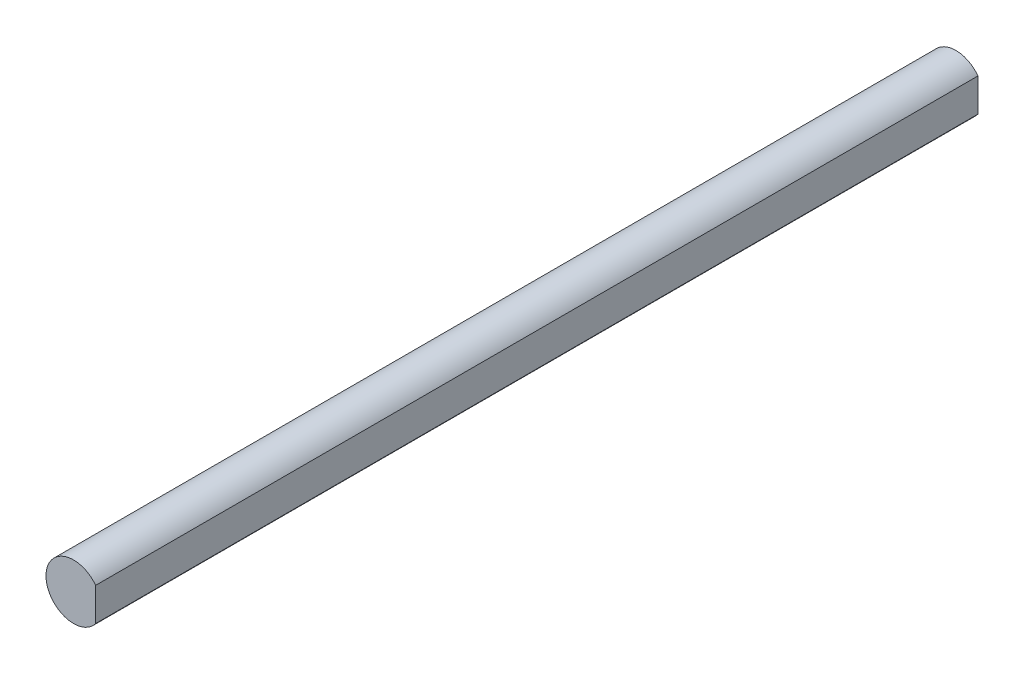
ISO-10303-21;
HEADER;
FILE_DESCRIPTION(('STEP AP214'),'2;1');
FILE_NAME('part.step','',(''),(''),'','','');
FILE_SCHEMA(('AUTOMOTIVE_DESIGN { 1 0 10303 214 1 1 1 1 }'));
ENDSEC;
DATA;
#1=APPLICATION_CONTEXT('core data for automotive mechanical design processes');
#2=APPLICATION_PROTOCOL_DEFINITION('international standard','automotive_design',2000,#1);
#3=PRODUCT_CONTEXT('',#1,'mechanical');
#4=PRODUCT('Part','Part','',(#3));
#5=PRODUCT_RELATED_PRODUCT_CATEGORY('part','',(#4));
#6=PRODUCT_DEFINITION_FORMATION('','',#4);
#7=PRODUCT_DEFINITION_CONTEXT('part definition',#1,'design');
#8=PRODUCT_DEFINITION('design','',#6,#7);
#9=PRODUCT_DEFINITION_SHAPE('','',#8);
#10=(LENGTH_UNIT() NAMED_UNIT(*) SI_UNIT(.MILLI.,.METRE.));
#11=(NAMED_UNIT(*) PLANE_ANGLE_UNIT() SI_UNIT($,.RADIAN.));
#12=(NAMED_UNIT(*) SI_UNIT($,.STERADIAN.) SOLID_ANGLE_UNIT());
#13=UNCERTAINTY_MEASURE_WITH_UNIT(LENGTH_MEASURE(1.E-05),#10,'distance_accuracy_value','');
#14=(GEOMETRIC_REPRESENTATION_CONTEXT(3) GLOBAL_UNCERTAINTY_ASSIGNED_CONTEXT((#13)) GLOBAL_UNIT_ASSIGNED_CONTEXT((#10,
#11,#12)) REPRESENTATION_CONTEXT('',''));
#15=CARTESIAN_POINT('',(0.,0.,0.));
#16=DIRECTION('',(0.,0.,1.));
#17=DIRECTION('',(1.,0.,0.));
#18=AXIS2_PLACEMENT_3D('',#15,#16,#17);
#19=CARTESIAN_POINT('',(0.,0.,101.6));
#20=DIRECTION('',(0.,0.,-1.));
#21=DIRECTION('',(-1.,0.,0.));
#22=AXIS2_PLACEMENT_3D('',#19,#20,#21);
#23=CYLINDRICAL_SURFACE('',#22,3.175);
#24=CARTESIAN_POINT('',(0.,0.,101.6));
#25=DIRECTION('',(0.,0.,1.));
#26=DIRECTION('',(1.,0.,0.));
#27=AXIS2_PLACEMENT_3D('',#24,#25,#26);
#28=CIRCLE('',#27,3.175);
#29=CARTESIAN_POINT('',(2.54,1.905,101.6));
#30=VERTEX_POINT('',#29);
#31=CARTESIAN_POINT('',(2.54,-1.905,101.6));
#32=VERTEX_POINT('',#31);
#33=EDGE_CURVE('E11',#30,#32,#28,.T.);
#34=ORIENTED_EDGE('',*,*,#33,.F.);
#35=DIRECTION('',(0.,0.,1.));
#36=VECTOR('',#35,1.);
#37=CARTESIAN_POINT('',(2.54,1.905,0.));
#38=LINE('',#37,#36);
#39=CARTESIAN_POINT('',(2.54,1.905,0.));
#40=VERTEX_POINT('',#39);
#41=EDGE_CURVE('E62',#40,#30,#38,.T.);
#42=ORIENTED_EDGE('',*,*,#41,.F.);
#43=CARTESIAN_POINT('',(0.,0.,0.));
#44=DIRECTION('',(0.,0.,1.));
#45=DIRECTION('',(1.,0.,0.));
#46=AXIS2_PLACEMENT_3D('',#43,#44,#45);
#47=CIRCLE('',#46,3.175);
#48=CARTESIAN_POINT('',(2.54,-1.905,0.));
#49=VERTEX_POINT('',#48);
#50=EDGE_CURVE('E41',#40,#49,#47,.T.);
#51=ORIENTED_EDGE('',*,*,#50,.T.);
#52=DIRECTION('',(0.,0.,1.));
#53=VECTOR('',#52,1.);
#54=CARTESIAN_POINT('',(2.54,-1.905,0.));
#55=LINE('',#54,#53);
#56=EDGE_CURVE('E53',#49,#32,#55,.T.);
#57=ORIENTED_EDGE('',*,*,#56,.T.);
#58=EDGE_LOOP('',(#34,#42,#51,#57));
#59=FACE_BOUND('',#58,.T.);
#60=ADVANCED_FACE('F38',(#59),#23,.T.);
#61=CARTESIAN_POINT('',(0.,0.,101.6));
#62=DIRECTION('',(0.,0.,1.));
#63=DIRECTION('',(1.,0.,0.));
#64=AXIS2_PLACEMENT_3D('',#61,#62,#63);
#65=PLANE('',#64);
#66=DIRECTION('',(0.,-1.,0.));
#67=VECTOR('',#66,1.);
#68=CARTESIAN_POINT('',(2.54,1.905,101.6));
#69=LINE('',#68,#67);
#70=EDGE_CURVE('E65',#30,#32,#69,.T.);
#71=ORIENTED_EDGE('',*,*,#70,.F.);
#72=ORIENTED_EDGE('',*,*,#33,.T.);
#73=EDGE_LOOP('',(#71,#72));
#74=FACE_BOUND('',#73,.T.);
#75=ADVANCED_FACE('F73',(#74),#65,.T.);
#76=CARTESIAN_POINT('',(0.,0.,0.));
#77=DIRECTION('',(0.,0.,1.));
#78=DIRECTION('',(1.,0.,0.));
#79=AXIS2_PLACEMENT_3D('',#76,#77,#78);
#80=PLANE('',#79);
#81=ORIENTED_EDGE('',*,*,#50,.F.);
#82=DIRECTION('',(0.,-1.,0.));
#83=VECTOR('',#82,1.);
#84=CARTESIAN_POINT('',(2.54,1.905,0.));
#85=LINE('',#84,#83);
#86=EDGE_CURVE('E58',#40,#49,#85,.T.);
#87=ORIENTED_EDGE('',*,*,#86,.T.);
#88=EDGE_LOOP('',(#81,#87));
#89=FACE_BOUND('',#88,.T.);
#90=ADVANCED_FACE('F82',(#89),#80,.F.);
#91=CARTESIAN_POINT('',(2.54,1.905,0.));
#92=DIRECTION('',(-1.,0.,0.));
#93=DIRECTION('',(0.,0.,1.));
#94=AXIS2_PLACEMENT_3D('',#91,#92,#93);
#95=PLANE('',#94);
#96=ORIENTED_EDGE('',*,*,#70,.T.);
#97=ORIENTED_EDGE('',*,*,#56,.F.);
#98=ORIENTED_EDGE('',*,*,#86,.F.);
#99=ORIENTED_EDGE('',*,*,#41,.T.);
#100=EDGE_LOOP('',(#96,#97,#98,#99));
#101=FACE_BOUND('',#100,.T.);
#102=ADVANCED_FACE('F64',(#101),#95,.F.);
#103=CLOSED_SHELL('',(#60,#75,#90,#102));
#104=MANIFOLD_SOLID_BREP('B2',#103);
#105=ADVANCED_BREP_SHAPE_REPRESENTATION('',(#18,#104),#14);
#106=SHAPE_DEFINITION_REPRESENTATION(#9,#105);
ENDSEC;
END-ISO-10303-21;
